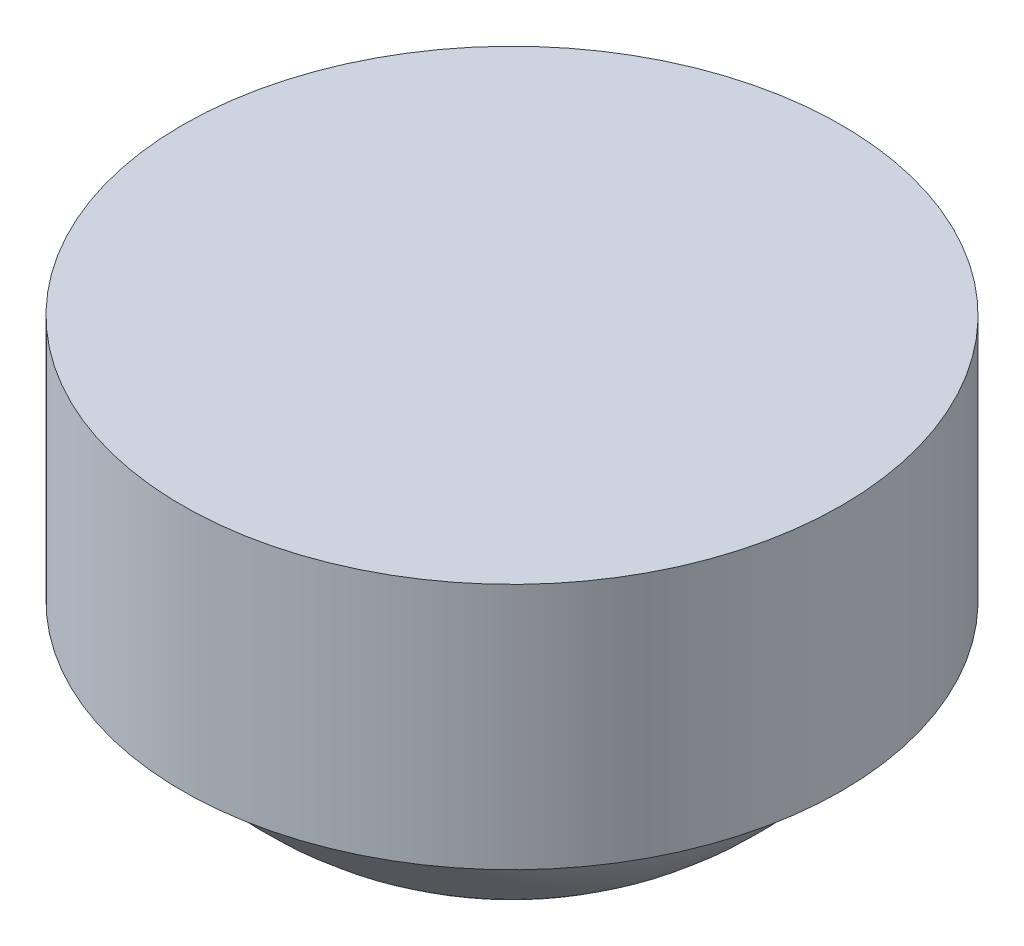
ISO-10303-21;
HEADER;
FILE_DESCRIPTION(('STEP AP214'),'2;1');
FILE_NAME('part.step','',(''),(''),'','','');
FILE_SCHEMA(('AUTOMOTIVE_DESIGN { 1 0 10303 214 1 1 1 1 }'));
ENDSEC;
DATA;
#1=APPLICATION_CONTEXT('core data for automotive mechanical design processes');
#2=APPLICATION_PROTOCOL_DEFINITION('international standard','automotive_design',2000,#1);
#3=PRODUCT_CONTEXT('',#1,'mechanical');
#4=PRODUCT('Part','Part','',(#3));
#5=PRODUCT_RELATED_PRODUCT_CATEGORY('part','',(#4));
#6=PRODUCT_DEFINITION_FORMATION('','',#4);
#7=PRODUCT_DEFINITION_CONTEXT('part definition',#1,'design');
#8=PRODUCT_DEFINITION('design','',#6,#7);
#9=PRODUCT_DEFINITION_SHAPE('','',#8);
#10=(LENGTH_UNIT() NAMED_UNIT(*) SI_UNIT(.MILLI.,.METRE.));
#11=(NAMED_UNIT(*) PLANE_ANGLE_UNIT() SI_UNIT($,.RADIAN.));
#12=(NAMED_UNIT(*) SI_UNIT($,.STERADIAN.) SOLID_ANGLE_UNIT());
#13=UNCERTAINTY_MEASURE_WITH_UNIT(LENGTH_MEASURE(1.E-05),#10,'distance_accuracy_value','');
#14=(GEOMETRIC_REPRESENTATION_CONTEXT(3) GLOBAL_UNCERTAINTY_ASSIGNED_CONTEXT((#13)) GLOBAL_UNIT_ASSIGNED_CONTEXT((#10,
#11,#12)) REPRESENTATION_CONTEXT('',''));
#15=CARTESIAN_POINT('',(0.,0.,0.));
#16=DIRECTION('',(0.,0.,1.));
#17=DIRECTION('',(1.,0.,0.));
#18=AXIS2_PLACEMENT_3D('',#15,#16,#17);
#19=CARTESIAN_POINT('',(4.12780920555633E-13,-67.0000000000005,0.));
#20=DIRECTION('',(0.,-1.,0.));
#21=DIRECTION('',(1.,0.,0.));
#22=AXIS2_PLACEMENT_3D('',#19,#20,#21);
#23=CYLINDRICAL_SURFACE('',#22,20.);
#24=CARTESIAN_POINT('',(4.12780920555633E-13,-67.0000000000004,0.));
#25=DIRECTION('',(0.,-1.,0.));
#26=DIRECTION('',(1.,0.,0.));
#27=AXIS2_PLACEMENT_3D('',#24,#25,#26);
#28=CIRCLE('',#27,20.);
#29=CARTESIAN_POINT('',(20.0000000000004,-67.0000000000005,0.));
#30=VERTEX_POINT('',#29);
#31=EDGE_CURVE('E10',#30,#30,#28,.T.);
#32=ORIENTED_EDGE('',*,*,#31,.T.);
#33=EDGE_LOOP('',(#32));
#34=FACE_BOUND('',#33,.T.);
#35=CARTESIAN_POINT('',(3.71527343767224E-13,-82.0000000000004,0.));
#36=DIRECTION('',(0.,-1.,0.));
#37=DIRECTION('',(1.,0.,0.));
#38=AXIS2_PLACEMENT_3D('',#35,#36,#37);
#39=CIRCLE('',#38,20.);
#40=CARTESIAN_POINT('',(20.0000000000004,-82.0000000000005,0.));
#41=VERTEX_POINT('',#40);
#42=EDGE_CURVE('E48',#41,#41,#39,.T.);
#43=ORIENTED_EDGE('',*,*,#42,.F.);
#44=EDGE_LOOP('',(#43));
#45=FACE_BOUND('',#44,.T.);
#46=ADVANCED_FACE('F36',(#34,#45),#23,.T.);
#47=CARTESIAN_POINT('',(20.0000000000004,-67.0000000000005,0.));
#48=DIRECTION('',(0.,1.,0.));
#49=DIRECTION('',(-1.,0.,0.));
#50=AXIS2_PLACEMENT_3D('',#47,#48,#49);
#51=PLANE('',#50);
#52=ORIENTED_EDGE('',*,*,#31,.F.);
#53=EDGE_LOOP('',(#52));
#54=FACE_BOUND('',#53,.T.);
#55=ADVANCED_FACE('F60',(#54),#51,.T.);
#56=CARTESIAN_POINT('',(4.03954647509863E-13,-72.0000000000005,0.));
#57=DIRECTION('',(0.,-1.,0.));
#58=DIRECTION('',(-1.,0.,0.));
#59=AXIS2_PLACEMENT_3D('',#56,#57,#58);
#60=SPHERICAL_SURFACE('',#59,21.);
#61=CARTESIAN_POINT('',(3.71527343767224E-13,-82.0000000000004,0.));
#62=DIRECTION('',(0.,-1.,0.));
#63=DIRECTION('',(1.,0.,0.));
#64=AXIS2_PLACEMENT_3D('',#61,#62,#63);
#65=CIRCLE('',#64,18.4661853126194);
#66=CARTESIAN_POINT('',(18.4661853126198,-82.0000000000005,0.));
#67=VERTEX_POINT('',#66);
#68=EDGE_CURVE('E43',#67,#67,#65,.T.);
#69=ORIENTED_EDGE('',*,*,#68,.T.);
#70=EDGE_LOOP('',(#69));
#71=FACE_BOUND('',#70,.T.);
#72=ADVANCED_FACE('F64',(#71),#60,.T.);
#73=CARTESIAN_POINT('',(18.4661853126198,-82.0000000000005,0.));
#74=DIRECTION('',(0.,-1.,0.));
#75=DIRECTION('',(1.,0.,0.));
#76=AXIS2_PLACEMENT_3D('',#73,#74,#75);
#77=PLANE('',#76);
#78=ORIENTED_EDGE('',*,*,#42,.T.);
#79=EDGE_LOOP('',(#78));
#80=FACE_BOUND('',#79,.T.);
#81=ORIENTED_EDGE('',*,*,#68,.F.);
#82=EDGE_LOOP('',(#81));
#83=FACE_BOUND('',#82,.T.);
#84=ADVANCED_FACE('F56',(#80,#83),#77,.T.);
#85=CLOSED_SHELL('',(#46,#55,#72,#84));
#86=MANIFOLD_SOLID_BREP('B2',#85);
#87=ADVANCED_BREP_SHAPE_REPRESENTATION('',(#18,#86),#14);
#88=SHAPE_DEFINITION_REPRESENTATION(#9,#87);
ENDSEC;
END-ISO-10303-21;
